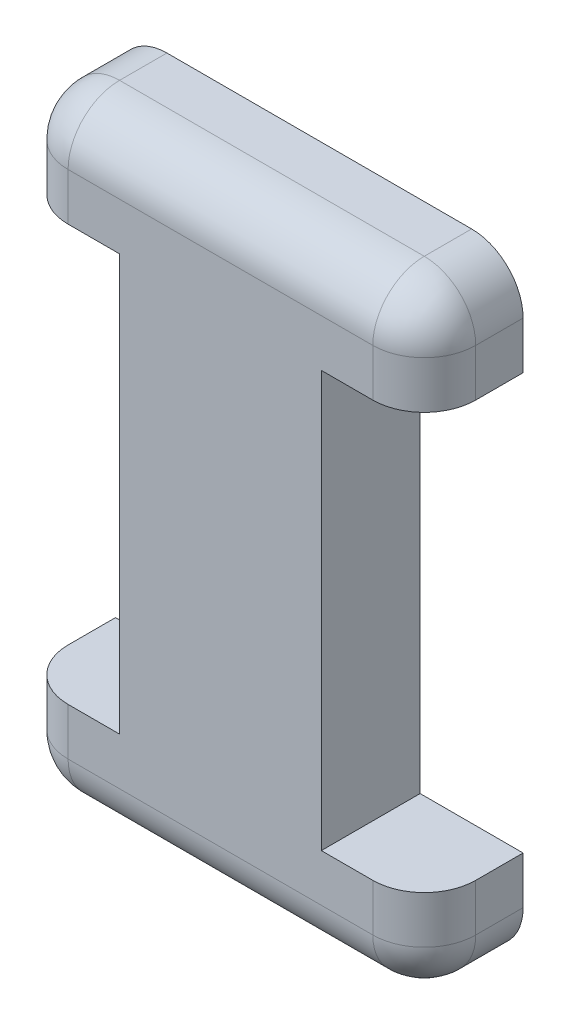
ISO-10303-21;
HEADER;
FILE_DESCRIPTION(('STEP AP214'),'2;1');
FILE_NAME('part.step','',(''),(''),'','','');
FILE_SCHEMA(('AUTOMOTIVE_DESIGN { 1 0 10303 214 1 1 1 1 }'));
ENDSEC;
DATA;
#1=APPLICATION_CONTEXT('core data for automotive mechanical design processes');
#2=APPLICATION_PROTOCOL_DEFINITION('international standard','automotive_design',2000,#1);
#3=PRODUCT_CONTEXT('',#1,'mechanical');
#4=PRODUCT('Part','Part','',(#3));
#5=PRODUCT_RELATED_PRODUCT_CATEGORY('part','',(#4));
#6=PRODUCT_DEFINITION_FORMATION('','',#4);
#7=PRODUCT_DEFINITION_CONTEXT('part definition',#1,'design');
#8=PRODUCT_DEFINITION('design','',#6,#7);
#9=PRODUCT_DEFINITION_SHAPE('','',#8);
#10=(LENGTH_UNIT() NAMED_UNIT(*) SI_UNIT(.MILLI.,.METRE.));
#11=(NAMED_UNIT(*) PLANE_ANGLE_UNIT() SI_UNIT($,.RADIAN.));
#12=(NAMED_UNIT(*) SI_UNIT($,.STERADIAN.) SOLID_ANGLE_UNIT());
#13=UNCERTAINTY_MEASURE_WITH_UNIT(LENGTH_MEASURE(1.E-05),#10,'distance_accuracy_value','');
#14=(GEOMETRIC_REPRESENTATION_CONTEXT(3) GLOBAL_UNCERTAINTY_ASSIGNED_CONTEXT((#13)) GLOBAL_UNIT_ASSIGNED_CONTEXT((#10,
#11,#12)) REPRESENTATION_CONTEXT('',''));
#15=CARTESIAN_POINT('',(0.,0.,0.));
#16=DIRECTION('',(0.,0.,1.));
#17=DIRECTION('',(1.,0.,0.));
#18=AXIS2_PLACEMENT_3D('',#15,#16,#17);
#19=CARTESIAN_POINT('',(4.9,-15.,4.8));
#20=DIRECTION('',(0.,1.,0.));
#21=DIRECTION('',(0.,0.,1.));
#22=AXIS2_PLACEMENT_3D('',#19,#20,#21);
#23=PLANE('',#22);
#24=DIRECTION('',(1.,0.,0.));
#25=VECTOR('',#24,1.);
#26=CARTESIAN_POINT('',(4.9,-15.,4.8));
#27=LINE('',#26,#25);
#28=CARTESIAN_POINT('',(4.9,-15.,4.8));
#29=VERTEX_POINT('',#28);
#30=CARTESIAN_POINT('',(7.4,-15.,4.8));
#31=VERTEX_POINT('',#30);
#32=EDGE_CURVE('E195',#29,#31,#27,.T.);
#33=ORIENTED_EDGE('',*,*,#32,.T.);
#34=CARTESIAN_POINT('',(7.4,-15.,2.3));
#35=DIRECTION('',(0.,1.,0.));
#36=DIRECTION('',(0.,0.,1.));
#37=AXIS2_PLACEMENT_3D('',#34,#35,#36);
#38=CIRCLE('',#37,2.5);
#39=CARTESIAN_POINT('',(9.9,-15.,2.3));
#40=VERTEX_POINT('',#39);
#41=EDGE_CURVE('E315',#31,#40,#38,.T.);
#42=ORIENTED_EDGE('',*,*,#41,.T.);
#43=DIRECTION('',(0.,0.,-1.));
#44=VECTOR('',#43,1.);
#45=CARTESIAN_POINT('',(9.9,-15.,4.8));
#46=LINE('',#45,#44);
#47=CARTESIAN_POINT('',(9.9,-15.,0.));
#48=VERTEX_POINT('',#47);
#49=EDGE_CURVE('E225',#40,#48,#46,.T.);
#50=ORIENTED_EDGE('',*,*,#49,.T.);
#51=DIRECTION('',(1.,0.,0.));
#52=VECTOR('',#51,1.);
#53=CARTESIAN_POINT('',(4.9,-15.,0.));
#54=LINE('',#53,#52);
#55=CARTESIAN_POINT('',(4.9,-15.,0.));
#56=VERTEX_POINT('',#55);
#57=EDGE_CURVE('E226',#56,#48,#54,.T.);
#58=ORIENTED_EDGE('',*,*,#57,.F.);
#59=DIRECTION('',(0.,0.,-1.));
#60=VECTOR('',#59,1.);
#61=CARTESIAN_POINT('',(4.9,-15.,4.8));
#62=LINE('',#61,#60);
#63=EDGE_CURVE('E270',#29,#56,#62,.T.);
#64=ORIENTED_EDGE('',*,*,#63,.F.);
#65=EDGE_LOOP('',(#33,#42,#50,#58,#64));
#66=FACE_BOUND('',#65,.T.);
#67=ADVANCED_FACE('F45',(#66),#23,.T.);
#68=CARTESIAN_POINT('',(4.9,-15.,4.8));
#69=DIRECTION('',(-1.,0.,0.));
#70=DIRECTION('',(0.,0.,1.));
#71=AXIS2_PLACEMENT_3D('',#68,#69,#70);
#72=PLANE('',#71);
#73=DIRECTION('',(0.,1.,0.));
#74=VECTOR('',#73,1.);
#75=CARTESIAN_POINT('',(4.9,-15.,0.));
#76=LINE('',#75,#74);
#77=CARTESIAN_POINT('',(4.9,5.2,0.));
#78=VERTEX_POINT('',#77);
#79=EDGE_CURVE('E267',#56,#78,#76,.T.);
#80=ORIENTED_EDGE('',*,*,#79,.T.);
#81=DIRECTION('',(0.,0.,-1.));
#82=VECTOR('',#81,1.);
#83=CARTESIAN_POINT('',(4.9,5.2,4.8));
#84=LINE('',#83,#82);
#85=CARTESIAN_POINT('',(4.9,5.2,4.8));
#86=VERTEX_POINT('',#85);
#87=EDGE_CURVE('E274',#86,#78,#84,.T.);
#88=ORIENTED_EDGE('',*,*,#87,.F.);
#89=DIRECTION('',(0.,1.,0.));
#90=VECTOR('',#89,1.);
#91=CARTESIAN_POINT('',(4.9,-15.,4.8));
#92=LINE('',#91,#90);
#93=EDGE_CURVE('E222',#29,#86,#92,.T.);
#94=ORIENTED_EDGE('',*,*,#93,.F.);
#95=ORIENTED_EDGE('',*,*,#63,.T.);
#96=EDGE_LOOP('',(#80,#88,#94,#95));
#97=FACE_BOUND('',#96,.T.);
#98=ADVANCED_FACE('F474',(#97),#72,.F.);
#99=CARTESIAN_POINT('',(4.9,5.2,4.8));
#100=DIRECTION('',(0.,1.,0.));
#101=DIRECTION('',(0.,0.,1.));
#102=AXIS2_PLACEMENT_3D('',#99,#100,#101);
#103=PLANE('',#102);
#104=DIRECTION('',(0.,0.,-1.));
#105=VECTOR('',#104,1.);
#106=CARTESIAN_POINT('',(9.9,5.2,4.8));
#107=LINE('',#106,#105);
#108=CARTESIAN_POINT('',(9.9,5.2,2.3));
#109=VERTEX_POINT('',#108);
#110=CARTESIAN_POINT('',(9.9,5.2,0.));
#111=VERTEX_POINT('',#110);
#112=EDGE_CURVE('E278',#109,#111,#107,.T.);
#113=ORIENTED_EDGE('',*,*,#112,.F.);
#114=CARTESIAN_POINT('',(7.4,5.2,2.3));
#115=DIRECTION('',(0.,1.,0.));
#116=DIRECTION('',(0.,0.,1.));
#117=AXIS2_PLACEMENT_3D('',#114,#115,#116);
#118=CIRCLE('',#117,2.5);
#119=CARTESIAN_POINT('',(7.4,5.2,4.8));
#120=VERTEX_POINT('',#119);
#121=EDGE_CURVE('E341',#109,#120,#118,.F.);
#122=ORIENTED_EDGE('',*,*,#121,.T.);
#123=DIRECTION('',(1.,0.,0.));
#124=VECTOR('',#123,1.);
#125=CARTESIAN_POINT('',(4.9,5.2,4.8));
#126=LINE('',#125,#124);
#127=EDGE_CURVE('E215',#86,#120,#126,.T.);
#128=ORIENTED_EDGE('',*,*,#127,.F.);
#129=ORIENTED_EDGE('',*,*,#87,.T.);
#130=DIRECTION('',(1.,0.,0.));
#131=VECTOR('',#130,1.);
#132=CARTESIAN_POINT('',(4.9,5.2,0.));
#133=LINE('',#132,#131);
#134=EDGE_CURVE('E263',#78,#111,#133,.T.);
#135=ORIENTED_EDGE('',*,*,#134,.T.);
#136=EDGE_LOOP('',(#113,#122,#128,#129,#135));
#137=FACE_BOUND('',#136,.T.);
#138=ADVANCED_FACE('F437',(#137),#103,.F.);
#139=CARTESIAN_POINT('',(9.9,5.2,4.8));
#140=DIRECTION('',(-1.,0.,0.));
#141=DIRECTION('',(0.,0.,1.));
#142=AXIS2_PLACEMENT_3D('',#139,#140,#141);
#143=PLANE('',#142);
#144=DIRECTION('',(0.,0.,-1.));
#145=VECTOR('',#144,1.);
#146=CARTESIAN_POINT('',(9.9,7.49999999999999,4.8));
#147=LINE('',#146,#145);
#148=CARTESIAN_POINT('',(9.9,7.49999999999999,0.));
#149=VERTEX_POINT('',#148);
#150=CARTESIAN_POINT('',(9.9,7.49999999999999,2.3));
#151=VERTEX_POINT('',#150);
#152=EDGE_CURVE('E335',#149,#151,#147,.F.);
#153=ORIENTED_EDGE('',*,*,#152,.T.);
#154=DIRECTION('',(0.,1.,0.));
#155=VECTOR('',#154,1.);
#156=CARTESIAN_POINT('',(9.9,5.2,2.3));
#157=LINE('',#156,#155);
#158=EDGE_CURVE('E338',#151,#109,#157,.F.);
#159=ORIENTED_EDGE('',*,*,#158,.T.);
#160=ORIENTED_EDGE('',*,*,#112,.T.);
#161=DIRECTION('',(0.,1.,0.));
#162=VECTOR('',#161,1.);
#163=CARTESIAN_POINT('',(9.9,5.2,0.));
#164=LINE('',#163,#162);
#165=EDGE_CURVE('E259',#111,#149,#164,.T.);
#166=ORIENTED_EDGE('',*,*,#165,.T.);
#167=EDGE_LOOP('',(#153,#159,#160,#166));
#168=FACE_BOUND('',#167,.T.);
#169=ADVANCED_FACE('F435',(#168),#143,.F.);
#170=CARTESIAN_POINT('',(9.9,9.99999999999999,4.8));
#171=DIRECTION('',(0.,-1.,0.));
#172=DIRECTION('',(0.,0.,-1.));
#173=AXIS2_PLACEMENT_3D('',#170,#171,#172);
#174=PLANE('',#173);
#175=DIRECTION('',(-1.,0.,0.));
#176=VECTOR('',#175,1.);
#177=CARTESIAN_POINT('',(9.9,9.99999999999999,0.));
#178=LINE('',#177,#176);
#179=CARTESIAN_POINT('',(7.4,9.99999999999999,0.));
#180=VERTEX_POINT('',#179);
#181=CARTESIAN_POINT('',(-7.4,9.99999999999999,0.));
#182=VERTEX_POINT('',#181);
#183=EDGE_CURVE('E255',#180,#182,#178,.T.);
#184=ORIENTED_EDGE('',*,*,#183,.T.);
#185=DIRECTION('',(0.,0.,-1.));
#186=VECTOR('',#185,1.);
#187=CARTESIAN_POINT('',(-7.4,9.99999999999999,4.8));
#188=LINE('',#187,#186);
#189=CARTESIAN_POINT('',(-7.4,9.99999999999999,2.3));
#190=VERTEX_POINT('',#189);
#191=EDGE_CURVE('E362',#182,#190,#188,.F.);
#192=ORIENTED_EDGE('',*,*,#191,.T.);
#193=DIRECTION('',(-1.,0.,0.));
#194=VECTOR('',#193,1.);
#195=CARTESIAN_POINT('',(9.9,9.99999999999999,2.3));
#196=LINE('',#195,#194);
#197=CARTESIAN_POINT('',(7.4,9.99999999999999,2.3));
#198=VERTEX_POINT('',#197);
#199=EDGE_CURVE('E359',#190,#198,#196,.F.);
#200=ORIENTED_EDGE('',*,*,#199,.T.);
#201=DIRECTION('',(0.,0.,-1.));
#202=VECTOR('',#201,1.);
#203=CARTESIAN_POINT('',(7.4,9.99999999999999,4.8));
#204=LINE('',#203,#202);
#205=EDGE_CURVE('E356',#198,#180,#204,.T.);
#206=ORIENTED_EDGE('',*,*,#205,.T.);
#207=EDGE_LOOP('',(#184,#192,#200,#206));
#208=FACE_BOUND('',#207,.T.);
#209=ADVANCED_FACE('F448',(#208),#174,.F.);
#210=CARTESIAN_POINT('',(-9.9,9.99999999999999,4.8));
#211=DIRECTION('',(1.,0.,0.));
#212=DIRECTION('',(0.,0.,-1.));
#213=AXIS2_PLACEMENT_3D('',#210,#211,#212);
#214=PLANE('',#213);
#215=DIRECTION('',(0.,0.,-1.));
#216=VECTOR('',#215,1.);
#217=CARTESIAN_POINT('',(-9.9,5.19999999999999,4.8));
#218=LINE('',#217,#216);
#219=CARTESIAN_POINT('',(-9.9,5.19999999999999,2.3));
#220=VERTEX_POINT('',#219);
#221=CARTESIAN_POINT('',(-9.9,5.19999999999999,0.));
#222=VERTEX_POINT('',#221);
#223=EDGE_CURVE('E281',#220,#222,#218,.T.);
#224=ORIENTED_EDGE('',*,*,#223,.F.);
#225=DIRECTION('',(0.,-1.,0.));
#226=VECTOR('',#225,1.);
#227=CARTESIAN_POINT('',(-9.9,9.99999999999999,2.3));
#228=LINE('',#227,#226);
#229=CARTESIAN_POINT('',(-9.9,7.49999999999999,2.3));
#230=VERTEX_POINT('',#229);
#231=EDGE_CURVE('E332',#220,#230,#228,.F.);
#232=ORIENTED_EDGE('',*,*,#231,.T.);
#233=DIRECTION('',(0.,0.,-1.));
#234=VECTOR('',#233,1.);
#235=CARTESIAN_POINT('',(-9.9,7.49999999999999,4.8));
#236=LINE('',#235,#234);
#237=CARTESIAN_POINT('',(-9.9,7.49999999999999,0.));
#238=VERTEX_POINT('',#237);
#239=EDGE_CURVE('E329',#230,#238,#236,.T.);
#240=ORIENTED_EDGE('',*,*,#239,.T.);
#241=DIRECTION('',(0.,-1.,0.));
#242=VECTOR('',#241,1.);
#243=CARTESIAN_POINT('',(-9.9,9.99999999999999,0.));
#244=LINE('',#243,#242);
#245=EDGE_CURVE('E252',#238,#222,#244,.T.);
#246=ORIENTED_EDGE('',*,*,#245,.T.);
#247=EDGE_LOOP('',(#224,#232,#240,#246));
#248=FACE_BOUND('',#247,.T.);
#249=ADVANCED_FACE('F464',(#248),#214,.F.);
#250=CARTESIAN_POINT('',(-9.9,5.19999999999999,4.8));
#251=DIRECTION('',(0.,1.,0.));
#252=DIRECTION('',(0.,0.,1.));
#253=AXIS2_PLACEMENT_3D('',#250,#251,#252);
#254=PLANE('',#253);
#255=DIRECTION('',(1.,0.,0.));
#256=VECTOR('',#255,1.);
#257=CARTESIAN_POINT('',(-9.9,5.19999999999999,4.8));
#258=LINE('',#257,#256);
#259=CARTESIAN_POINT('',(-7.4,5.19999999999999,4.8));
#260=VERTEX_POINT('',#259);
#261=CARTESIAN_POINT('',(-4.9,5.19999999999999,4.8));
#262=VERTEX_POINT('',#261);
#263=EDGE_CURVE('E210',#260,#262,#258,.T.);
#264=ORIENTED_EDGE('',*,*,#263,.F.);
#265=CARTESIAN_POINT('',(-7.4,5.19999999999999,2.3));
#266=DIRECTION('',(0.,1.,0.));
#267=DIRECTION('',(0.,0.,1.));
#268=AXIS2_PLACEMENT_3D('',#265,#266,#267);
#269=CIRCLE('',#268,2.5);
#270=EDGE_CURVE('E326',#260,#220,#269,.F.);
#271=ORIENTED_EDGE('',*,*,#270,.T.);
#272=ORIENTED_EDGE('',*,*,#223,.T.);
#273=DIRECTION('',(1.,0.,0.));
#274=VECTOR('',#273,1.);
#275=CARTESIAN_POINT('',(-9.9,5.19999999999999,0.));
#276=LINE('',#275,#274);
#277=CARTESIAN_POINT('',(-4.9,5.19999999999999,0.));
#278=VERTEX_POINT('',#277);
#279=EDGE_CURVE('E248',#222,#278,#276,.T.);
#280=ORIENTED_EDGE('',*,*,#279,.T.);
#281=DIRECTION('',(0.,0.,-1.));
#282=VECTOR('',#281,1.);
#283=CARTESIAN_POINT('',(-4.9,5.19999999999999,4.8));
#284=LINE('',#283,#282);
#285=EDGE_CURVE('E204',#262,#278,#284,.T.);
#286=ORIENTED_EDGE('',*,*,#285,.F.);
#287=EDGE_LOOP('',(#264,#271,#272,#280,#286));
#288=FACE_BOUND('',#287,.T.);
#289=ADVANCED_FACE('F462',(#288),#254,.F.);
#290=CARTESIAN_POINT('',(-4.9,-15.,4.8));
#291=DIRECTION('',(-1.,0.,0.));
#292=DIRECTION('',(0.,0.,1.));
#293=AXIS2_PLACEMENT_3D('',#290,#291,#292);
#294=PLANE('',#293);
#295=DIRECTION('',(0.,1.,0.));
#296=VECTOR('',#295,1.);
#297=CARTESIAN_POINT('',(-4.9,-15.,0.));
#298=LINE('',#297,#296);
#299=CARTESIAN_POINT('',(-4.9,-15.,0.));
#300=VERTEX_POINT('',#299);
#301=EDGE_CURVE('E201',#300,#278,#298,.T.);
#302=ORIENTED_EDGE('',*,*,#301,.F.);
#303=DIRECTION('',(0.,0.,-1.));
#304=VECTOR('',#303,1.);
#305=CARTESIAN_POINT('',(-4.9,-15.,4.8));
#306=LINE('',#305,#304);
#307=CARTESIAN_POINT('',(-4.9,-15.,4.8));
#308=VERTEX_POINT('',#307);
#309=EDGE_CURVE('E186',#308,#300,#306,.T.);
#310=ORIENTED_EDGE('',*,*,#309,.F.);
#311=DIRECTION('',(0.,1.,0.));
#312=VECTOR('',#311,1.);
#313=CARTESIAN_POINT('',(-4.9,-15.,4.8));
#314=LINE('',#313,#312);
#315=EDGE_CURVE('E194',#308,#262,#314,.T.);
#316=ORIENTED_EDGE('',*,*,#315,.T.);
#317=ORIENTED_EDGE('',*,*,#285,.T.);
#318=EDGE_LOOP('',(#302,#310,#316,#317));
#319=FACE_BOUND('',#318,.T.);
#320=ADVANCED_FACE('F199',(#319),#294,.T.);
#321=CARTESIAN_POINT('',(-9.9,-15.,4.8));
#322=DIRECTION('',(0.,1.,0.));
#323=DIRECTION('',(-1.,0.,0.));
#324=AXIS2_PLACEMENT_3D('',#321,#322,#323);
#325=PLANE('',#324);
#326=DIRECTION('',(0.,0.,-1.));
#327=VECTOR('',#326,1.);
#328=CARTESIAN_POINT('',(-9.9,-15.,4.8));
#329=LINE('',#328,#327);
#330=CARTESIAN_POINT('',(-9.9,-15.,2.3));
#331=VERTEX_POINT('',#330);
#332=CARTESIAN_POINT('',(-9.9,-15.,0.));
#333=VERTEX_POINT('',#332);
#334=EDGE_CURVE('E205',#331,#333,#329,.T.);
#335=ORIENTED_EDGE('',*,*,#334,.F.);
#336=CARTESIAN_POINT('',(-7.4,-15.,2.3));
#337=DIRECTION('',(0.,1.,0.));
#338=DIRECTION('',(-1.,0.,0.));
#339=AXIS2_PLACEMENT_3D('',#336,#337,#338);
#340=CIRCLE('',#339,2.5);
#341=CARTESIAN_POINT('',(-7.4,-15.,4.8));
#342=VERTEX_POINT('',#341);
#343=EDGE_CURVE('E189',#331,#342,#340,.T.);
#344=ORIENTED_EDGE('',*,*,#343,.T.);
#345=DIRECTION('',(1.,0.,0.));
#346=VECTOR('',#345,1.);
#347=CARTESIAN_POINT('',(-9.9,-15.,4.8));
#348=LINE('',#347,#346);
#349=EDGE_CURVE('E181',#342,#308,#348,.T.);
#350=ORIENTED_EDGE('',*,*,#349,.T.);
#351=ORIENTED_EDGE('',*,*,#309,.T.);
#352=DIRECTION('',(1.,0.,0.));
#353=VECTOR('',#352,1.);
#354=CARTESIAN_POINT('',(-9.9,-15.,0.));
#355=LINE('',#354,#353);
#356=EDGE_CURVE('E243',#333,#300,#355,.T.);
#357=ORIENTED_EDGE('',*,*,#356,.F.);
#358=EDGE_LOOP('',(#335,#344,#350,#351,#357));
#359=FACE_BOUND('',#358,.T.);
#360=ADVANCED_FACE('F184',(#359),#325,.T.);
#361=CARTESIAN_POINT('',(-9.9,-19.8,4.8));
#362=DIRECTION('',(-1.,0.,0.));
#363=DIRECTION('',(0.,0.,1.));
#364=AXIS2_PLACEMENT_3D('',#361,#362,#363);
#365=PLANE('',#364);
#366=DIRECTION('',(0.,0.,-1.));
#367=VECTOR('',#366,1.);
#368=CARTESIAN_POINT('',(-9.9,-17.3,4.8));
#369=LINE('',#368,#367);
#370=CARTESIAN_POINT('',(-9.9,-17.3,0.));
#371=VERTEX_POINT('',#370);
#372=CARTESIAN_POINT('',(-9.9,-17.3,2.3));
#373=VERTEX_POINT('',#372);
#374=EDGE_CURVE('E318',#371,#373,#369,.F.);
#375=ORIENTED_EDGE('',*,*,#374,.T.);
#376=DIRECTION('',(0.,1.,0.));
#377=VECTOR('',#376,1.);
#378=CARTESIAN_POINT('',(-9.9,-15.,2.3));
#379=LINE('',#378,#377);
#380=EDGE_CURVE('E321',#373,#331,#379,.T.);
#381=ORIENTED_EDGE('',*,*,#380,.T.);
#382=ORIENTED_EDGE('',*,*,#334,.T.);
#383=DIRECTION('',(0.,1.,0.));
#384=VECTOR('',#383,1.);
#385=CARTESIAN_POINT('',(-9.9,-19.8,0.));
#386=LINE('',#385,#384);
#387=EDGE_CURVE('E239',#371,#333,#386,.T.);
#388=ORIENTED_EDGE('',*,*,#387,.F.);
#389=EDGE_LOOP('',(#375,#381,#382,#388));
#390=FACE_BOUND('',#389,.T.);
#391=ADVANCED_FACE('F596',(#390),#365,.T.);
#392=CARTESIAN_POINT('',(9.9,-19.8,4.8));
#393=DIRECTION('',(0.,-1.,0.));
#394=DIRECTION('',(0.,0.,-1.));
#395=AXIS2_PLACEMENT_3D('',#392,#393,#394);
#396=PLANE('',#395);
#397=DIRECTION('',(-1.,0.,0.));
#398=VECTOR('',#397,1.);
#399=CARTESIAN_POINT('',(-9.9,-19.8,2.3));
#400=LINE('',#399,#398);
#401=CARTESIAN_POINT('',(7.4,-19.8,2.3));
#402=VERTEX_POINT('',#401);
#403=CARTESIAN_POINT('',(-7.4,-19.8,2.3));
#404=VERTEX_POINT('',#403);
#405=EDGE_CURVE('E55',#402,#404,#400,.T.);
#406=ORIENTED_EDGE('',*,*,#405,.T.);
#407=DIRECTION('',(0.,0.,-1.));
#408=VECTOR('',#407,1.);
#409=CARTESIAN_POINT('',(-7.4,-19.8,4.8));
#410=LINE('',#409,#408);
#411=CARTESIAN_POINT('',(-7.4,-19.8,0.));
#412=VERTEX_POINT('',#411);
#413=EDGE_CURVE('E11',#404,#412,#410,.T.);
#414=ORIENTED_EDGE('',*,*,#413,.T.);
#415=DIRECTION('',(-1.,0.,0.));
#416=VECTOR('',#415,1.);
#417=CARTESIAN_POINT('',(9.9,-19.8,0.));
#418=LINE('',#417,#416);
#419=CARTESIAN_POINT('',(7.4,-19.8,0.));
#420=VERTEX_POINT('',#419);
#421=EDGE_CURVE('E235',#420,#412,#418,.T.);
#422=ORIENTED_EDGE('',*,*,#421,.F.);
#423=DIRECTION('',(0.,0.,-1.));
#424=VECTOR('',#423,1.);
#425=CARTESIAN_POINT('',(7.4,-19.8,4.8));
#426=LINE('',#425,#424);
#427=EDGE_CURVE('E66',#420,#402,#426,.F.);
#428=ORIENTED_EDGE('',*,*,#427,.T.);
#429=EDGE_LOOP('',(#406,#414,#422,#428));
#430=FACE_BOUND('',#429,.T.);
#431=ADVANCED_FACE('F588',(#430),#396,.T.);
#432=CARTESIAN_POINT('',(9.9,-15.,4.8));
#433=DIRECTION('',(1.,0.,0.));
#434=DIRECTION('',(0.,1.,0.));
#435=AXIS2_PLACEMENT_3D('',#432,#433,#434);
#436=PLANE('',#435);
#437=ORIENTED_EDGE('',*,*,#49,.F.);
#438=DIRECTION('',(0.,-1.,0.));
#439=VECTOR('',#438,1.);
#440=CARTESIAN_POINT('',(9.9,-19.8,2.3));
#441=LINE('',#440,#439);
#442=CARTESIAN_POINT('',(9.9,-17.3,2.3));
#443=VERTEX_POINT('',#442);
#444=EDGE_CURVE('E293',#40,#443,#441,.T.);
#445=ORIENTED_EDGE('',*,*,#444,.T.);
#446=DIRECTION('',(0.,0.,-1.));
#447=VECTOR('',#446,1.);
#448=CARTESIAN_POINT('',(9.9,-17.3,4.8));
#449=LINE('',#448,#447);
#450=CARTESIAN_POINT('',(9.9,-17.3,0.));
#451=VERTEX_POINT('',#450);
#452=EDGE_CURVE('E273',#443,#451,#449,.T.);
#453=ORIENTED_EDGE('',*,*,#452,.T.);
#454=DIRECTION('',(0.,-1.,0.));
#455=VECTOR('',#454,1.);
#456=CARTESIAN_POINT('',(9.9,-15.,0.));
#457=LINE('',#456,#455);
#458=EDGE_CURVE('E230',#48,#451,#457,.T.);
#459=ORIENTED_EDGE('',*,*,#458,.F.);
#460=EDGE_LOOP('',(#437,#445,#453,#459));
#461=FACE_BOUND('',#460,.T.);
#462=ADVANCED_FACE('F487',(#461),#436,.T.);
#463=CARTESIAN_POINT('',(0.,0.,4.8));
#464=DIRECTION('',(0.,0.,-1.));
#465=DIRECTION('',(-1.,0.,0.));
#466=AXIS2_PLACEMENT_3D('',#463,#464,#465);
#467=PLANE('',#466);
#468=DIRECTION('',(-1.,0.,0.));
#469=VECTOR('',#468,1.);
#470=CARTESIAN_POINT('',(0.,7.49999999999999,4.8));
#471=LINE('',#470,#469);
#472=CARTESIAN_POINT('',(7.4,7.49999999999999,4.8));
#473=VERTEX_POINT('',#472);
#474=CARTESIAN_POINT('',(-7.4,7.49999999999999,4.8));
#475=VERTEX_POINT('',#474);
#476=EDGE_CURVE('E306',#473,#475,#471,.T.);
#477=ORIENTED_EDGE('',*,*,#476,.T.);
#478=DIRECTION('',(0.,-1.,0.));
#479=VECTOR('',#478,1.);
#480=CARTESIAN_POINT('',(-7.4,0.,4.8));
#481=LINE('',#480,#479);
#482=EDGE_CURVE('E312',#475,#260,#481,.T.);
#483=ORIENTED_EDGE('',*,*,#482,.T.);
#484=ORIENTED_EDGE('',*,*,#263,.T.);
#485=ORIENTED_EDGE('',*,*,#315,.F.);
#486=ORIENTED_EDGE('',*,*,#349,.F.);
#487=DIRECTION('',(0.,1.,0.));
#488=VECTOR('',#487,1.);
#489=CARTESIAN_POINT('',(-7.4,-19.8,4.8));
#490=LINE('',#489,#488);
#491=CARTESIAN_POINT('',(-7.4,-17.3,4.8));
#492=VERTEX_POINT('',#491);
#493=EDGE_CURVE('E300',#342,#492,#490,.F.);
#494=ORIENTED_EDGE('',*,*,#493,.T.);
#495=DIRECTION('',(-1.,0.,0.));
#496=VECTOR('',#495,1.);
#497=CARTESIAN_POINT('',(9.9,-17.3,4.8));
#498=LINE('',#497,#496);
#499=CARTESIAN_POINT('',(7.4,-17.3,4.8));
#500=VERTEX_POINT('',#499);
#501=EDGE_CURVE('E297',#492,#500,#498,.F.);
#502=ORIENTED_EDGE('',*,*,#501,.T.);
#503=DIRECTION('',(0.,-1.,0.));
#504=VECTOR('',#503,1.);
#505=CARTESIAN_POINT('',(7.4,-15.,4.8));
#506=LINE('',#505,#504);
#507=EDGE_CURVE('E303',#500,#31,#506,.F.);
#508=ORIENTED_EDGE('',*,*,#507,.T.);
#509=ORIENTED_EDGE('',*,*,#32,.F.);
#510=ORIENTED_EDGE('',*,*,#93,.T.);
#511=ORIENTED_EDGE('',*,*,#127,.T.);
#512=DIRECTION('',(0.,1.,0.));
#513=VECTOR('',#512,1.);
#514=CARTESIAN_POINT('',(7.4,0.,4.8));
#515=LINE('',#514,#513);
#516=EDGE_CURVE('E309',#120,#473,#515,.T.);
#517=ORIENTED_EDGE('',*,*,#516,.T.);
#518=EDGE_LOOP('',(#477,#483,#484,#485,#486,#494,#502,#508,#509,#510,#511,#517));
#519=FACE_BOUND('',#518,.T.);
#520=ADVANCED_FACE('F207',(#519),#467,.F.);
#521=CARTESIAN_POINT('',(0.,0.,0.));
#522=DIRECTION('',(0.,0.,-1.));
#523=DIRECTION('',(-1.,0.,0.));
#524=AXIS2_PLACEMENT_3D('',#521,#522,#523);
#525=PLANE('',#524);
#526=ORIENTED_EDGE('',*,*,#245,.F.);
#527=CARTESIAN_POINT('',(-7.4,7.49999999999999,0.));
#528=DIRECTION('',(0.,0.,-1.));
#529=DIRECTION('',(-1.,0.,0.));
#530=AXIS2_PLACEMENT_3D('',#527,#528,#529);
#531=CIRCLE('',#530,2.5);
#532=EDGE_CURVE('E353',#238,#182,#531,.T.);
#533=ORIENTED_EDGE('',*,*,#532,.T.);
#534=ORIENTED_EDGE('',*,*,#183,.F.);
#535=CARTESIAN_POINT('',(7.4,7.49999999999999,0.));
#536=DIRECTION('',(0.,0.,-1.));
#537=DIRECTION('',(-1.,0.,0.));
#538=AXIS2_PLACEMENT_3D('',#535,#536,#537);
#539=CIRCLE('',#538,2.5);
#540=EDGE_CURVE('E350',#180,#149,#539,.T.);
#541=ORIENTED_EDGE('',*,*,#540,.T.);
#542=ORIENTED_EDGE('',*,*,#165,.F.);
#543=ORIENTED_EDGE('',*,*,#134,.F.);
#544=ORIENTED_EDGE('',*,*,#79,.F.);
#545=ORIENTED_EDGE('',*,*,#57,.T.);
#546=ORIENTED_EDGE('',*,*,#458,.T.);
#547=CARTESIAN_POINT('',(7.4,-17.3,0.));
#548=DIRECTION('',(0.,0.,-1.));
#549=DIRECTION('',(-1.,0.,0.));
#550=AXIS2_PLACEMENT_3D('',#547,#548,#549);
#551=CIRCLE('',#550,2.5);
#552=EDGE_CURVE('E344',#451,#420,#551,.T.);
#553=ORIENTED_EDGE('',*,*,#552,.T.);
#554=ORIENTED_EDGE('',*,*,#421,.T.);
#555=CARTESIAN_POINT('',(-7.4,-17.3,0.));
#556=DIRECTION('',(0.,0.,-1.));
#557=DIRECTION('',(-1.,0.,0.));
#558=AXIS2_PLACEMENT_3D('',#555,#556,#557);
#559=CIRCLE('',#558,2.5);
#560=EDGE_CURVE('E347',#412,#371,#559,.T.);
#561=ORIENTED_EDGE('',*,*,#560,.T.);
#562=ORIENTED_EDGE('',*,*,#387,.T.);
#563=ORIENTED_EDGE('',*,*,#356,.T.);
#564=ORIENTED_EDGE('',*,*,#301,.T.);
#565=ORIENTED_EDGE('',*,*,#279,.F.);
#566=EDGE_LOOP('',(#526,#533,#534,#541,#542,#543,#544,#545,#546,#553,#554,#561,#562,#563,#564,#565));
#567=FACE_BOUND('',#566,.T.);
#568=ADVANCED_FACE('F444',(#567),#525,.T.);
#569=CARTESIAN_POINT('',(-7.4,-17.3,4.8));
#570=DIRECTION('',(0.,0.,-1.));
#571=DIRECTION('',(-1.,0.,0.));
#572=AXIS2_PLACEMENT_3D('',#569,#570,#571);
#573=CYLINDRICAL_SURFACE('',#572,2.5);
#574=ORIENTED_EDGE('',*,*,#560,.F.);
#575=ORIENTED_EDGE('',*,*,#413,.F.);
#576=CARTESIAN_POINT('',(-7.4,-17.3,2.3));
#577=DIRECTION('',(0.,0.,1.));
#578=DIRECTION('',(1.,0.,0.));
#579=AXIS2_PLACEMENT_3D('',#576,#577,#578);
#580=CIRCLE('',#579,2.5);
#581=EDGE_CURVE('E231',#373,#404,#580,.T.);
#582=ORIENTED_EDGE('',*,*,#581,.F.);
#583=ORIENTED_EDGE('',*,*,#374,.F.);
#584=EDGE_LOOP('',(#574,#575,#582,#583));
#585=FACE_BOUND('',#584,.T.);
#586=ADVANCED_FACE('F512',(#585),#573,.T.);
#587=CARTESIAN_POINT('',(-7.4,-19.8,2.3));
#588=DIRECTION('',(0.,-1.,0.));
#589=DIRECTION('',(0.,0.,-1.));
#590=AXIS2_PLACEMENT_3D('',#587,#588,#589);
#591=CYLINDRICAL_SURFACE('',#590,2.5);
#592=ORIENTED_EDGE('',*,*,#343,.F.);
#593=ORIENTED_EDGE('',*,*,#380,.F.);
#594=CARTESIAN_POINT('',(-7.4,-17.3,2.3));
#595=DIRECTION('',(0.,-1.,0.));
#596=DIRECTION('',(0.,0.,-1.));
#597=AXIS2_PLACEMENT_3D('',#594,#595,#596);
#598=CIRCLE('',#597,2.5);
#599=EDGE_CURVE('E384',#492,#373,#598,.T.);
#600=ORIENTED_EDGE('',*,*,#599,.F.);
#601=ORIENTED_EDGE('',*,*,#493,.F.);
#602=EDGE_LOOP('',(#592,#593,#600,#601));
#603=FACE_BOUND('',#602,.T.);
#604=ADVANCED_FACE('F508',(#603),#591,.T.);
#605=CARTESIAN_POINT('',(-7.4,-17.3,2.3));
#606=DIRECTION('',(-1.,0.,0.));
#607=DIRECTION('',(0.,0.,1.));
#608=AXIS2_PLACEMENT_3D('',#605,#606,#607);
#609=SPHERICAL_SURFACE('',#608,2.5);
#610=ORIENTED_EDGE('',*,*,#599,.T.);
#611=ORIENTED_EDGE('',*,*,#581,.T.);
#612=CARTESIAN_POINT('',(-7.4,-17.3,2.3));
#613=DIRECTION('',(-1.,0.,0.));
#614=DIRECTION('',(0.,0.,1.));
#615=AXIS2_PLACEMENT_3D('',#612,#613,#614);
#616=CIRCLE('',#615,2.5);
#617=EDGE_CURVE('E380',#492,#404,#616,.F.);
#618=ORIENTED_EDGE('',*,*,#617,.F.);
#619=EDGE_LOOP('',(#610,#611,#618));
#620=FACE_BOUND('',#619,.T.);
#621=ADVANCED_FACE('F504',(#620),#609,.T.);
#622=CARTESIAN_POINT('',(7.4,-17.3,4.8));
#623=DIRECTION('',(0.,0.,-1.));
#624=DIRECTION('',(-1.,0.,0.));
#625=AXIS2_PLACEMENT_3D('',#622,#623,#624);
#626=CYLINDRICAL_SURFACE('',#625,2.5);
#627=ORIENTED_EDGE('',*,*,#552,.F.);
#628=ORIENTED_EDGE('',*,*,#452,.F.);
#629=CARTESIAN_POINT('',(7.4,-17.3,2.3));
#630=DIRECTION('',(0.,0.,1.));
#631=DIRECTION('',(1.,0.,0.));
#632=AXIS2_PLACEMENT_3D('',#629,#630,#631);
#633=CIRCLE('',#632,2.5);
#634=EDGE_CURVE('E376',#402,#443,#633,.T.);
#635=ORIENTED_EDGE('',*,*,#634,.F.);
#636=ORIENTED_EDGE('',*,*,#427,.F.);
#637=EDGE_LOOP('',(#627,#628,#635,#636));
#638=FACE_BOUND('',#637,.T.);
#639=ADVANCED_FACE('F500',(#638),#626,.T.);
#640=CARTESIAN_POINT('',(9.9,-17.3,2.3));
#641=DIRECTION('',(1.,0.,0.));
#642=DIRECTION('',(0.,0.,-1.));
#643=AXIS2_PLACEMENT_3D('',#640,#641,#642);
#644=CYLINDRICAL_SURFACE('',#643,2.5);
#645=ORIENTED_EDGE('',*,*,#617,.T.);
#646=ORIENTED_EDGE('',*,*,#405,.F.);
#647=CARTESIAN_POINT('',(7.4,-17.3,2.3));
#648=DIRECTION('',(1.,0.,0.));
#649=DIRECTION('',(0.,0.,-1.));
#650=AXIS2_PLACEMENT_3D('',#647,#648,#649);
#651=CIRCLE('',#650,2.5);
#652=EDGE_CURVE('E372',#500,#402,#651,.T.);
#653=ORIENTED_EDGE('',*,*,#652,.F.);
#654=ORIENTED_EDGE('',*,*,#501,.F.);
#655=EDGE_LOOP('',(#645,#646,#653,#654));
#656=FACE_BOUND('',#655,.T.);
#657=ADVANCED_FACE('F496',(#656),#644,.T.);
#658=CARTESIAN_POINT('',(7.4,-17.3,2.3));
#659=DIRECTION('',(0.,-1.,0.));
#660=DIRECTION('',(0.,0.,-1.));
#661=AXIS2_PLACEMENT_3D('',#658,#659,#660);
#662=SPHERICAL_SURFACE('',#661,2.5);
#663=ORIENTED_EDGE('',*,*,#652,.T.);
#664=ORIENTED_EDGE('',*,*,#634,.T.);
#665=CARTESIAN_POINT('',(7.4,-17.3,2.3));
#666=DIRECTION('',(0.,-1.,0.));
#667=DIRECTION('',(0.,0.,-1.));
#668=AXIS2_PLACEMENT_3D('',#665,#666,#667);
#669=CIRCLE('',#668,2.5);
#670=EDGE_CURVE('E369',#500,#443,#669,.F.);
#671=ORIENTED_EDGE('',*,*,#670,.F.);
#672=EDGE_LOOP('',(#663,#664,#671));
#673=FACE_BOUND('',#672,.T.);
#674=ADVANCED_FACE('F492',(#673),#662,.T.);
#675=CARTESIAN_POINT('',(7.4,-15.,2.3));
#676=DIRECTION('',(0.,1.,0.));
#677=DIRECTION('',(-1.,0.,0.));
#678=AXIS2_PLACEMENT_3D('',#675,#676,#677);
#679=CYLINDRICAL_SURFACE('',#678,2.5);
#680=ORIENTED_EDGE('',*,*,#41,.F.);
#681=ORIENTED_EDGE('',*,*,#507,.F.);
#682=ORIENTED_EDGE('',*,*,#670,.T.);
#683=ORIENTED_EDGE('',*,*,#444,.F.);
#684=EDGE_LOOP('',(#680,#681,#682,#683));
#685=FACE_BOUND('',#684,.T.);
#686=ADVANCED_FACE('F489',(#685),#679,.T.);
#687=CARTESIAN_POINT('',(7.4,7.49999999999999,4.8));
#688=DIRECTION('',(0.,0.,-1.));
#689=DIRECTION('',(-1.,0.,0.));
#690=AXIS2_PLACEMENT_3D('',#687,#688,#689);
#691=CYLINDRICAL_SURFACE('',#690,2.5);
#692=ORIENTED_EDGE('',*,*,#540,.F.);
#693=ORIENTED_EDGE('',*,*,#205,.F.);
#694=CARTESIAN_POINT('',(7.4,7.49999999999999,2.3));
#695=DIRECTION('',(0.,0.,1.));
#696=DIRECTION('',(1.,0.,0.));
#697=AXIS2_PLACEMENT_3D('',#694,#695,#696);
#698=CIRCLE('',#697,2.5);
#699=EDGE_CURVE('E49',#151,#198,#698,.T.);
#700=ORIENTED_EDGE('',*,*,#699,.F.);
#701=ORIENTED_EDGE('',*,*,#152,.F.);
#702=EDGE_LOOP('',(#692,#693,#700,#701));
#703=FACE_BOUND('',#702,.T.);
#704=ADVANCED_FACE('F47',(#703),#691,.T.);
#705=CARTESIAN_POINT('',(7.4,0.,2.3));
#706=DIRECTION('',(0.,1.,0.));
#707=DIRECTION('',(0.,0.,1.));
#708=AXIS2_PLACEMENT_3D('',#705,#706,#707);
#709=CYLINDRICAL_SURFACE('',#708,2.5);
#710=ORIENTED_EDGE('',*,*,#121,.F.);
#711=ORIENTED_EDGE('',*,*,#158,.F.);
#712=CARTESIAN_POINT('',(7.4,7.49999999999999,2.3));
#713=DIRECTION('',(0.,1.,0.));
#714=DIRECTION('',(0.,0.,1.));
#715=AXIS2_PLACEMENT_3D('',#712,#713,#714);
#716=CIRCLE('',#715,2.5);
#717=EDGE_CURVE('E406',#473,#151,#716,.T.);
#718=ORIENTED_EDGE('',*,*,#717,.F.);
#719=ORIENTED_EDGE('',*,*,#516,.F.);
#720=EDGE_LOOP('',(#710,#711,#718,#719));
#721=FACE_BOUND('',#720,.T.);
#722=ADVANCED_FACE('F432',(#721),#709,.T.);
#723=CARTESIAN_POINT('',(7.4,7.49999999999999,2.3));
#724=DIRECTION('',(1.,0.,0.));
#725=DIRECTION('',(0.,0.,-1.));
#726=AXIS2_PLACEMENT_3D('',#723,#724,#725);
#727=SPHERICAL_SURFACE('',#726,2.5);
#728=ORIENTED_EDGE('',*,*,#717,.T.);
#729=ORIENTED_EDGE('',*,*,#699,.T.);
#730=CARTESIAN_POINT('',(7.4,7.49999999999999,2.3));
#731=DIRECTION('',(1.,0.,0.));
#732=DIRECTION('',(0.,0.,-1.));
#733=AXIS2_PLACEMENT_3D('',#730,#731,#732);
#734=CIRCLE('',#733,2.5);
#735=EDGE_CURVE('E403',#473,#198,#734,.F.);
#736=ORIENTED_EDGE('',*,*,#735,.F.);
#737=EDGE_LOOP('',(#728,#729,#736));
#738=FACE_BOUND('',#737,.T.);
#739=ADVANCED_FACE('F415',(#738),#727,.T.);
#740=CARTESIAN_POINT('',(-7.4,7.49999999999999,4.8));
#741=DIRECTION('',(0.,0.,-1.));
#742=DIRECTION('',(-1.,0.,0.));
#743=AXIS2_PLACEMENT_3D('',#740,#741,#742);
#744=CYLINDRICAL_SURFACE('',#743,2.5);
#745=ORIENTED_EDGE('',*,*,#532,.F.);
#746=ORIENTED_EDGE('',*,*,#239,.F.);
#747=CARTESIAN_POINT('',(-7.4,7.49999999999999,2.3));
#748=DIRECTION('',(0.,0.,1.));
#749=DIRECTION('',(1.,0.,0.));
#750=AXIS2_PLACEMENT_3D('',#747,#748,#749);
#751=CIRCLE('',#750,2.5);
#752=EDGE_CURVE('E399',#190,#230,#751,.T.);
#753=ORIENTED_EDGE('',*,*,#752,.F.);
#754=ORIENTED_EDGE('',*,*,#191,.F.);
#755=EDGE_LOOP('',(#745,#746,#753,#754));
#756=FACE_BOUND('',#755,.T.);
#757=ADVANCED_FACE('F454',(#756),#744,.T.);
#758=CARTESIAN_POINT('',(0.,7.49999999999999,2.3));
#759=DIRECTION('',(-1.,0.,0.));
#760=DIRECTION('',(0.,0.,1.));
#761=AXIS2_PLACEMENT_3D('',#758,#759,#760);
#762=CYLINDRICAL_SURFACE('',#761,2.5);
#763=ORIENTED_EDGE('',*,*,#735,.T.);
#764=ORIENTED_EDGE('',*,*,#199,.F.);
#765=CARTESIAN_POINT('',(-7.4,7.49999999999999,2.3));
#766=DIRECTION('',(-1.,0.,0.));
#767=DIRECTION('',(0.,0.,1.));
#768=AXIS2_PLACEMENT_3D('',#765,#766,#767);
#769=CIRCLE('',#768,2.5);
#770=EDGE_CURVE('E395',#475,#190,#769,.T.);
#771=ORIENTED_EDGE('',*,*,#770,.F.);
#772=ORIENTED_EDGE('',*,*,#476,.F.);
#773=EDGE_LOOP('',(#763,#764,#771,#772));
#774=FACE_BOUND('',#773,.T.);
#775=ADVANCED_FACE('F422',(#774),#762,.T.);
#776=CARTESIAN_POINT('',(-7.4,7.49999999999999,2.3));
#777=DIRECTION('',(0.,1.,0.));
#778=DIRECTION('',(0.,0.,1.));
#779=AXIS2_PLACEMENT_3D('',#776,#777,#778);
#780=SPHERICAL_SURFACE('',#779,2.5);
#781=ORIENTED_EDGE('',*,*,#770,.T.);
#782=ORIENTED_EDGE('',*,*,#752,.T.);
#783=CARTESIAN_POINT('',(-7.4,7.49999999999999,2.3));
#784=DIRECTION('',(0.,1.,0.));
#785=DIRECTION('',(0.,0.,1.));
#786=AXIS2_PLACEMENT_3D('',#783,#784,#785);
#787=CIRCLE('',#786,2.5);
#788=EDGE_CURVE('E391',#475,#230,#787,.F.);
#789=ORIENTED_EDGE('',*,*,#788,.F.);
#790=EDGE_LOOP('',(#781,#782,#789));
#791=FACE_BOUND('',#790,.T.);
#792=ADVANCED_FACE('F456',(#791),#780,.T.);
#793=CARTESIAN_POINT('',(-7.4,0.,2.3));
#794=DIRECTION('',(0.,-1.,0.));
#795=DIRECTION('',(0.,0.,-1.));
#796=AXIS2_PLACEMENT_3D('',#793,#794,#795);
#797=CYLINDRICAL_SURFACE('',#796,2.5);
#798=ORIENTED_EDGE('',*,*,#788,.T.);
#799=ORIENTED_EDGE('',*,*,#231,.F.);
#800=ORIENTED_EDGE('',*,*,#270,.F.);
#801=ORIENTED_EDGE('',*,*,#482,.F.);
#802=EDGE_LOOP('',(#798,#799,#800,#801));
#803=FACE_BOUND('',#802,.T.);
#804=ADVANCED_FACE('F459',(#803),#797,.T.);
#805=CLOSED_SHELL('',(#67,#98,#138,#169,#209,#249,#289,#320,#360,#391,#431,#462,#520,#568,#586,
#604,#621,#639,#657,#674,#686,#704,#722,#739,#757,#775,#792,#804));
#806=MANIFOLD_SOLID_BREP('B2',#805);
#807=ADVANCED_BREP_SHAPE_REPRESENTATION('',(#18,#806),#14);
#808=SHAPE_DEFINITION_REPRESENTATION(#9,#807);
ENDSEC;
END-ISO-10303-21;
